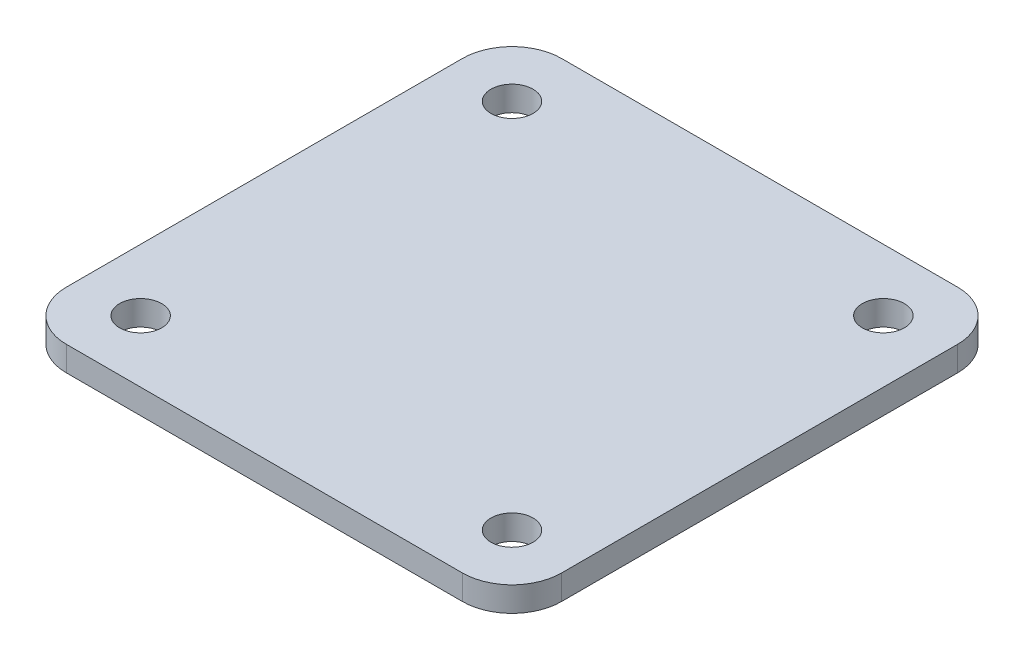
ISO-10303-21;
HEADER;
FILE_DESCRIPTION(('STEP AP214'),'2;1');
FILE_NAME('part.step','',(''),(''),'','','');
FILE_SCHEMA(('AUTOMOTIVE_DESIGN { 1 0 10303 214 1 1 1 1 }'));
ENDSEC;
DATA;
#1=APPLICATION_CONTEXT('core data for automotive mechanical design processes');
#2=APPLICATION_PROTOCOL_DEFINITION('international standard','automotive_design',2000,#1);
#3=PRODUCT_CONTEXT('',#1,'mechanical');
#4=PRODUCT('Part','Part','',(#3));
#5=PRODUCT_RELATED_PRODUCT_CATEGORY('part','',(#4));
#6=PRODUCT_DEFINITION_FORMATION('','',#4);
#7=PRODUCT_DEFINITION_CONTEXT('part definition',#1,'design');
#8=PRODUCT_DEFINITION('design','',#6,#7);
#9=PRODUCT_DEFINITION_SHAPE('','',#8);
#10=(LENGTH_UNIT() NAMED_UNIT(*) SI_UNIT(.MILLI.,.METRE.));
#11=(NAMED_UNIT(*) PLANE_ANGLE_UNIT() SI_UNIT($,.RADIAN.));
#12=(NAMED_UNIT(*) SI_UNIT($,.STERADIAN.) SOLID_ANGLE_UNIT());
#13=UNCERTAINTY_MEASURE_WITH_UNIT(LENGTH_MEASURE(1.E-05),#10,'distance_accuracy_value','');
#14=(GEOMETRIC_REPRESENTATION_CONTEXT(3) GLOBAL_UNCERTAINTY_ASSIGNED_CONTEXT((#13)) GLOBAL_UNIT_ASSIGNED_CONTEXT((#10,
#11,#12)) REPRESENTATION_CONTEXT('',''));
#15=CARTESIAN_POINT('',(0.,0.,0.));
#16=DIRECTION('',(0.,0.,1.));
#17=DIRECTION('',(1.,0.,0.));
#18=AXIS2_PLACEMENT_3D('',#15,#16,#17);
#19=CARTESIAN_POINT('',(-20.,2.,-20.));
#20=DIRECTION('',(1.,0.,0.));
#21=DIRECTION('',(0.,0.,-1.));
#22=AXIS2_PLACEMENT_3D('',#19,#20,#21);
#23=PLANE('',#22);
#24=DIRECTION('',(0.,0.,1.));
#25=VECTOR('',#24,1.);
#26=CARTESIAN_POINT('',(-20.,2.,-20.));
#27=LINE('',#26,#25);
#28=CARTESIAN_POINT('',(-20.,2.,-16.));
#29=VERTEX_POINT('',#28);
#30=CARTESIAN_POINT('',(-20.,2.,16.));
#31=VERTEX_POINT('',#30);
#32=EDGE_CURVE('E118',#29,#31,#27,.T.);
#33=ORIENTED_EDGE('',*,*,#32,.F.);
#34=DIRECTION('',(0.,-1.,0.));
#35=VECTOR('',#34,1.);
#36=CARTESIAN_POINT('',(-20.,2.,-16.));
#37=LINE('',#36,#35);
#38=CARTESIAN_POINT('',(-20.,0.,-16.));
#39=VERTEX_POINT('',#38);
#40=EDGE_CURVE('E103',#29,#39,#37,.T.);
#41=ORIENTED_EDGE('',*,*,#40,.T.);
#42=DIRECTION('',(0.,0.,1.));
#43=VECTOR('',#42,1.);
#44=CARTESIAN_POINT('',(-20.,0.,-20.));
#45=LINE('',#44,#43);
#46=CARTESIAN_POINT('',(-20.,0.,16.));
#47=VERTEX_POINT('',#46);
#48=EDGE_CURVE('E115',#39,#47,#45,.T.);
#49=ORIENTED_EDGE('',*,*,#48,.T.);
#50=DIRECTION('',(0.,-1.,0.));
#51=VECTOR('',#50,1.);
#52=CARTESIAN_POINT('',(-20.,2.,16.));
#53=LINE('',#52,#51);
#54=EDGE_CURVE('E120',#47,#31,#53,.F.);
#55=ORIENTED_EDGE('',*,*,#54,.T.);
#56=EDGE_LOOP('',(#33,#41,#49,#55));
#57=FACE_BOUND('',#56,.T.);
#58=ADVANCED_FACE('F33',(#57),#23,.F.);
#59=CARTESIAN_POINT('',(20.,2.,20.));
#60=DIRECTION('',(0.,0.,-1.));
#61=DIRECTION('',(-1.,0.,0.));
#62=AXIS2_PLACEMENT_3D('',#59,#60,#61);
#63=PLANE('',#62);
#64=DIRECTION('',(1.,0.,0.));
#65=VECTOR('',#64,1.);
#66=CARTESIAN_POINT('',(20.,2.,20.));
#67=LINE('',#66,#65);
#68=CARTESIAN_POINT('',(-16.,2.,20.));
#69=VERTEX_POINT('',#68);
#70=CARTESIAN_POINT('',(16.,2.,20.));
#71=VERTEX_POINT('',#70);
#72=EDGE_CURVE('E164',#69,#71,#67,.T.);
#73=ORIENTED_EDGE('',*,*,#72,.F.);
#74=DIRECTION('',(0.,-1.,0.));
#75=VECTOR('',#74,1.);
#76=CARTESIAN_POINT('',(-16.,2.,20.));
#77=LINE('',#76,#75);
#78=CARTESIAN_POINT('',(-16.,0.,20.));
#79=VERTEX_POINT('',#78);
#80=EDGE_CURVE('E157',#69,#79,#77,.T.);
#81=ORIENTED_EDGE('',*,*,#80,.T.);
#82=DIRECTION('',(1.,0.,0.));
#83=VECTOR('',#82,1.);
#84=CARTESIAN_POINT('',(20.,0.,20.));
#85=LINE('',#84,#83);
#86=CARTESIAN_POINT('',(16.,0.,20.));
#87=VERTEX_POINT('',#86);
#88=EDGE_CURVE('E124',#79,#87,#85,.T.);
#89=ORIENTED_EDGE('',*,*,#88,.T.);
#90=DIRECTION('',(0.,-1.,0.));
#91=VECTOR('',#90,1.);
#92=CARTESIAN_POINT('',(16.,2.,20.));
#93=LINE('',#92,#91);
#94=EDGE_CURVE('E155',#87,#71,#93,.F.);
#95=ORIENTED_EDGE('',*,*,#94,.T.);
#96=EDGE_LOOP('',(#73,#81,#89,#95));
#97=FACE_BOUND('',#96,.T.);
#98=ADVANCED_FACE('F162',(#97),#63,.F.);
#99=CARTESIAN_POINT('',(20.,2.,-20.));
#100=DIRECTION('',(-1.,0.,0.));
#101=DIRECTION('',(0.,0.,1.));
#102=AXIS2_PLACEMENT_3D('',#99,#100,#101);
#103=PLANE('',#102);
#104=DIRECTION('',(0.,0.,-1.));
#105=VECTOR('',#104,1.);
#106=CARTESIAN_POINT('',(20.,2.,-20.));
#107=LINE('',#106,#105);
#108=CARTESIAN_POINT('',(20.,2.,16.));
#109=VERTEX_POINT('',#108);
#110=CARTESIAN_POINT('',(20.,2.,-16.));
#111=VERTEX_POINT('',#110);
#112=EDGE_CURVE('E172',#109,#111,#107,.T.);
#113=ORIENTED_EDGE('',*,*,#112,.F.);
#114=DIRECTION('',(0.,-1.,0.));
#115=VECTOR('',#114,1.);
#116=CARTESIAN_POINT('',(20.,2.,16.));
#117=LINE('',#116,#115);
#118=CARTESIAN_POINT('',(20.,0.,16.));
#119=VERTEX_POINT('',#118);
#120=EDGE_CURVE('E11',#109,#119,#117,.T.);
#121=ORIENTED_EDGE('',*,*,#120,.T.);
#122=DIRECTION('',(0.,0.,-1.));
#123=VECTOR('',#122,1.);
#124=CARTESIAN_POINT('',(20.,0.,-20.));
#125=LINE('',#124,#123);
#126=CARTESIAN_POINT('',(20.,0.,-16.));
#127=VERTEX_POINT('',#126);
#128=EDGE_CURVE('E128',#119,#127,#125,.T.);
#129=ORIENTED_EDGE('',*,*,#128,.T.);
#130=DIRECTION('',(0.,-1.,0.));
#131=VECTOR('',#130,1.);
#132=CARTESIAN_POINT('',(20.,2.,-16.));
#133=LINE('',#132,#131);
#134=EDGE_CURVE('E41',#127,#111,#133,.F.);
#135=ORIENTED_EDGE('',*,*,#134,.T.);
#136=EDGE_LOOP('',(#113,#121,#129,#135));
#137=FACE_BOUND('',#136,.T.);
#138=ADVANCED_FACE('F171',(#137),#103,.F.);
#139=CARTESIAN_POINT('',(20.,2.,-20.));
#140=DIRECTION('',(0.,0.,1.));
#141=DIRECTION('',(1.,0.,0.));
#142=AXIS2_PLACEMENT_3D('',#139,#140,#141);
#143=PLANE('',#142);
#144=DIRECTION('',(-1.,0.,0.));
#145=VECTOR('',#144,1.);
#146=CARTESIAN_POINT('',(20.,0.,-20.));
#147=LINE('',#146,#145);
#148=CARTESIAN_POINT('',(16.,0.,-20.));
#149=VERTEX_POINT('',#148);
#150=CARTESIAN_POINT('',(-16.,0.,-20.));
#151=VERTEX_POINT('',#150);
#152=EDGE_CURVE('E138',#149,#151,#147,.T.);
#153=ORIENTED_EDGE('',*,*,#152,.T.);
#154=DIRECTION('',(0.,-1.,0.));
#155=VECTOR('',#154,1.);
#156=CARTESIAN_POINT('',(-16.,2.,-20.));
#157=LINE('',#156,#155);
#158=CARTESIAN_POINT('',(-16.,2.,-20.));
#159=VERTEX_POINT('',#158);
#160=EDGE_CURVE('E104',#151,#159,#157,.F.);
#161=ORIENTED_EDGE('',*,*,#160,.T.);
#162=DIRECTION('',(-1.,0.,0.));
#163=VECTOR('',#162,1.);
#164=CARTESIAN_POINT('',(20.,2.,-20.));
#165=LINE('',#164,#163);
#166=CARTESIAN_POINT('',(16.,2.,-20.));
#167=VERTEX_POINT('',#166);
#168=EDGE_CURVE('E134',#167,#159,#165,.T.);
#169=ORIENTED_EDGE('',*,*,#168,.F.);
#170=DIRECTION('',(0.,-1.,0.));
#171=VECTOR('',#170,1.);
#172=CARTESIAN_POINT('',(16.,2.,-20.));
#173=LINE('',#172,#171);
#174=EDGE_CURVE('E109',#167,#149,#173,.T.);
#175=ORIENTED_EDGE('',*,*,#174,.T.);
#176=EDGE_LOOP('',(#153,#161,#169,#175));
#177=FACE_BOUND('',#176,.T.);
#178=ADVANCED_FACE('F212',(#177),#143,.F.);
#179=CARTESIAN_POINT('',(0.,2.,0.));
#180=DIRECTION('',(0.,-1.,0.));
#181=DIRECTION('',(0.,0.,-1.));
#182=AXIS2_PLACEMENT_3D('',#179,#180,#181);
#183=PLANE('',#182);
#184=CARTESIAN_POINT('',(-15.,2.,-15.));
#185=DIRECTION('',(0.,1.,0.));
#186=DIRECTION('',(0.,0.,1.));
#187=AXIS2_PLACEMENT_3D('',#184,#185,#186);
#188=CIRCLE('',#187,1.7);
#189=CARTESIAN_POINT('',(-15.,2.,-13.3));
#190=VERTEX_POINT('',#189);
#191=EDGE_CURVE('E181',#190,#190,#188,.T.);
#192=ORIENTED_EDGE('',*,*,#191,.F.);
#193=EDGE_LOOP('',(#192));
#194=FACE_BOUND('',#193,.T.);
#195=CARTESIAN_POINT('',(-15.,2.,15.));
#196=DIRECTION('',(0.,1.,0.));
#197=DIRECTION('',(0.,0.,1.));
#198=AXIS2_PLACEMENT_3D('',#195,#196,#197);
#199=CIRCLE('',#198,1.7);
#200=CARTESIAN_POINT('',(-15.,2.,16.7));
#201=VERTEX_POINT('',#200);
#202=EDGE_CURVE('E187',#201,#201,#199,.T.);
#203=ORIENTED_EDGE('',*,*,#202,.F.);
#204=EDGE_LOOP('',(#203));
#205=FACE_BOUND('',#204,.T.);
#206=CARTESIAN_POINT('',(15.,2.,15.));
#207=DIRECTION('',(0.,1.,0.));
#208=DIRECTION('',(0.,0.,1.));
#209=AXIS2_PLACEMENT_3D('',#206,#207,#208);
#210=CIRCLE('',#209,1.7);
#211=CARTESIAN_POINT('',(15.,2.,16.7));
#212=VERTEX_POINT('',#211);
#213=EDGE_CURVE('E193',#212,#212,#210,.T.);
#214=ORIENTED_EDGE('',*,*,#213,.F.);
#215=EDGE_LOOP('',(#214));
#216=FACE_BOUND('',#215,.T.);
#217=CARTESIAN_POINT('',(15.,2.,-15.));
#218=DIRECTION('',(0.,1.,0.));
#219=DIRECTION('',(0.,0.,1.));
#220=AXIS2_PLACEMENT_3D('',#217,#218,#219);
#221=CIRCLE('',#220,1.7);
#222=CARTESIAN_POINT('',(15.,2.,-13.3));
#223=VERTEX_POINT('',#222);
#224=EDGE_CURVE('E131',#223,#223,#221,.T.);
#225=ORIENTED_EDGE('',*,*,#224,.F.);
#226=EDGE_LOOP('',(#225));
#227=FACE_BOUND('',#226,.T.);
#228=ORIENTED_EDGE('',*,*,#168,.T.);
#229=CARTESIAN_POINT('',(-16.,2.,-16.));
#230=DIRECTION('',(0.,-1.,0.));
#231=DIRECTION('',(0.,0.,-1.));
#232=AXIS2_PLACEMENT_3D('',#229,#230,#231);
#233=CIRCLE('',#232,4.);
#234=EDGE_CURVE('E153',#159,#29,#233,.F.);
#235=ORIENTED_EDGE('',*,*,#234,.T.);
#236=ORIENTED_EDGE('',*,*,#32,.T.);
#237=CARTESIAN_POINT('',(-16.,2.,16.));
#238=DIRECTION('',(0.,-1.,0.));
#239=DIRECTION('',(0.,0.,-1.));
#240=AXIS2_PLACEMENT_3D('',#237,#238,#239);
#241=CIRCLE('',#240,4.);
#242=EDGE_CURVE('E151',#31,#69,#241,.F.);
#243=ORIENTED_EDGE('',*,*,#242,.T.);
#244=ORIENTED_EDGE('',*,*,#72,.T.);
#245=CARTESIAN_POINT('',(16.,2.,16.));
#246=DIRECTION('',(0.,-1.,0.));
#247=DIRECTION('',(0.,0.,-1.));
#248=AXIS2_PLACEMENT_3D('',#245,#246,#247);
#249=CIRCLE('',#248,4.);
#250=EDGE_CURVE('E54',#71,#109,#249,.F.);
#251=ORIENTED_EDGE('',*,*,#250,.T.);
#252=ORIENTED_EDGE('',*,*,#112,.T.);
#253=CARTESIAN_POINT('',(16.,2.,-16.));
#254=DIRECTION('',(0.,-1.,0.));
#255=DIRECTION('',(0.,0.,-1.));
#256=AXIS2_PLACEMENT_3D('',#253,#254,#255);
#257=CIRCLE('',#256,4.);
#258=EDGE_CURVE('E148',#111,#167,#257,.F.);
#259=ORIENTED_EDGE('',*,*,#258,.T.);
#260=EDGE_LOOP('',(#228,#235,#236,#243,#244,#251,#252,#259));
#261=FACE_BOUND('',#260,.T.);
#262=ADVANCED_FACE('F209',(#194,#205,#216,#227,#261),#183,.F.);
#263=CARTESIAN_POINT('',(0.,0.,0.));
#264=DIRECTION('',(0.,-1.,0.));
#265=DIRECTION('',(0.,0.,-1.));
#266=AXIS2_PLACEMENT_3D('',#263,#264,#265);
#267=PLANE('',#266);
#268=CARTESIAN_POINT('',(-15.,0.,-15.));
#269=DIRECTION('',(0.,1.,0.));
#270=DIRECTION('',(0.,0.,1.));
#271=AXIS2_PLACEMENT_3D('',#268,#269,#270);
#272=CIRCLE('',#271,1.7);
#273=CARTESIAN_POINT('',(-15.,0.,-13.3));
#274=VERTEX_POINT('',#273);
#275=EDGE_CURVE('E184',#274,#274,#272,.T.);
#276=ORIENTED_EDGE('',*,*,#275,.T.);
#277=EDGE_LOOP('',(#276));
#278=FACE_BOUND('',#277,.T.);
#279=CARTESIAN_POINT('',(-15.,0.,15.));
#280=DIRECTION('',(0.,1.,0.));
#281=DIRECTION('',(0.,0.,1.));
#282=AXIS2_PLACEMENT_3D('',#279,#280,#281);
#283=CIRCLE('',#282,1.7);
#284=CARTESIAN_POINT('',(-15.,0.,16.7));
#285=VERTEX_POINT('',#284);
#286=EDGE_CURVE('E190',#285,#285,#283,.T.);
#287=ORIENTED_EDGE('',*,*,#286,.T.);
#288=EDGE_LOOP('',(#287));
#289=FACE_BOUND('',#288,.T.);
#290=CARTESIAN_POINT('',(15.,0.,15.));
#291=DIRECTION('',(0.,1.,0.));
#292=DIRECTION('',(0.,0.,1.));
#293=AXIS2_PLACEMENT_3D('',#290,#291,#292);
#294=CIRCLE('',#293,1.7);
#295=CARTESIAN_POINT('',(15.,0.,16.7));
#296=VERTEX_POINT('',#295);
#297=EDGE_CURVE('E179',#296,#296,#294,.T.);
#298=ORIENTED_EDGE('',*,*,#297,.T.);
#299=EDGE_LOOP('',(#298));
#300=FACE_BOUND('',#299,.T.);
#301=CARTESIAN_POINT('',(15.,0.,-15.));
#302=DIRECTION('',(0.,1.,0.));
#303=DIRECTION('',(0.,0.,1.));
#304=AXIS2_PLACEMENT_3D('',#301,#302,#303);
#305=CIRCLE('',#304,1.7);
#306=CARTESIAN_POINT('',(15.,0.,-13.3));
#307=VERTEX_POINT('',#306);
#308=EDGE_CURVE('E125',#307,#307,#305,.T.);
#309=ORIENTED_EDGE('',*,*,#308,.T.);
#310=EDGE_LOOP('',(#309));
#311=FACE_BOUND('',#310,.T.);
#312=ORIENTED_EDGE('',*,*,#48,.F.);
#313=CARTESIAN_POINT('',(-16.,0.,-16.));
#314=DIRECTION('',(0.,-1.,0.));
#315=DIRECTION('',(0.,0.,-1.));
#316=AXIS2_PLACEMENT_3D('',#313,#314,#315);
#317=CIRCLE('',#316,4.);
#318=EDGE_CURVE('E99',#39,#151,#317,.T.);
#319=ORIENTED_EDGE('',*,*,#318,.T.);
#320=ORIENTED_EDGE('',*,*,#152,.F.);
#321=CARTESIAN_POINT('',(16.,0.,-16.));
#322=DIRECTION('',(0.,-1.,0.));
#323=DIRECTION('',(0.,0.,-1.));
#324=AXIS2_PLACEMENT_3D('',#321,#322,#323);
#325=CIRCLE('',#324,4.);
#326=EDGE_CURVE('E119',#149,#127,#325,.T.);
#327=ORIENTED_EDGE('',*,*,#326,.T.);
#328=ORIENTED_EDGE('',*,*,#128,.F.);
#329=CARTESIAN_POINT('',(16.,0.,16.));
#330=DIRECTION('',(0.,-1.,0.));
#331=DIRECTION('',(0.,0.,-1.));
#332=AXIS2_PLACEMENT_3D('',#329,#330,#331);
#333=CIRCLE('',#332,4.);
#334=EDGE_CURVE('E142',#119,#87,#333,.T.);
#335=ORIENTED_EDGE('',*,*,#334,.T.);
#336=ORIENTED_EDGE('',*,*,#88,.F.);
#337=CARTESIAN_POINT('',(-16.,0.,16.));
#338=DIRECTION('',(0.,-1.,0.));
#339=DIRECTION('',(0.,0.,-1.));
#340=AXIS2_PLACEMENT_3D('',#337,#338,#339);
#341=CIRCLE('',#340,4.);
#342=EDGE_CURVE('E110',#79,#47,#341,.T.);
#343=ORIENTED_EDGE('',*,*,#342,.T.);
#344=EDGE_LOOP('',(#312,#319,#320,#327,#328,#335,#336,#343));
#345=FACE_BOUND('',#344,.T.);
#346=ADVANCED_FACE('F122',(#278,#289,#300,#311,#345),#267,.T.);
#347=CARTESIAN_POINT('',(15.,0.,-15.));
#348=DIRECTION('',(0.,1.,0.));
#349=DIRECTION('',(0.,0.,1.));
#350=AXIS2_PLACEMENT_3D('',#347,#348,#349);
#351=CYLINDRICAL_SURFACE('',#350,1.7);
#352=ORIENTED_EDGE('',*,*,#308,.F.);
#353=EDGE_LOOP('',(#352));
#354=FACE_BOUND('',#353,.T.);
#355=ORIENTED_EDGE('',*,*,#224,.T.);
#356=EDGE_LOOP('',(#355));
#357=FACE_BOUND('',#356,.T.);
#358=ADVANCED_FACE('F205',(#354,#357),#351,.F.);
#359=CARTESIAN_POINT('',(15.,0.,15.));
#360=DIRECTION('',(0.,1.,0.));
#361=DIRECTION('',(0.,0.,1.));
#362=AXIS2_PLACEMENT_3D('',#359,#360,#361);
#363=CYLINDRICAL_SURFACE('',#362,1.7);
#364=ORIENTED_EDGE('',*,*,#297,.F.);
#365=EDGE_LOOP('',(#364));
#366=FACE_BOUND('',#365,.T.);
#367=ORIENTED_EDGE('',*,*,#213,.T.);
#368=EDGE_LOOP('',(#367));
#369=FACE_BOUND('',#368,.T.);
#370=ADVANCED_FACE('F201',(#366,#369),#363,.F.);
#371=CARTESIAN_POINT('',(-15.,0.,15.));
#372=DIRECTION('',(0.,1.,0.));
#373=DIRECTION('',(0.,0.,1.));
#374=AXIS2_PLACEMENT_3D('',#371,#372,#373);
#375=CYLINDRICAL_SURFACE('',#374,1.7);
#376=ORIENTED_EDGE('',*,*,#286,.F.);
#377=EDGE_LOOP('',(#376));
#378=FACE_BOUND('',#377,.T.);
#379=ORIENTED_EDGE('',*,*,#202,.T.);
#380=EDGE_LOOP('',(#379));
#381=FACE_BOUND('',#380,.T.);
#382=ADVANCED_FACE('F204',(#378,#381),#375,.F.);
#383=CARTESIAN_POINT('',(-15.,0.,-15.));
#384=DIRECTION('',(0.,1.,0.));
#385=DIRECTION('',(0.,0.,1.));
#386=AXIS2_PLACEMENT_3D('',#383,#384,#385);
#387=CYLINDRICAL_SURFACE('',#386,1.7);
#388=ORIENTED_EDGE('',*,*,#275,.F.);
#389=EDGE_LOOP('',(#388));
#390=FACE_BOUND('',#389,.T.);
#391=ORIENTED_EDGE('',*,*,#191,.T.);
#392=EDGE_LOOP('',(#391));
#393=FACE_BOUND('',#392,.T.);
#394=ADVANCED_FACE('F235',(#390,#393),#387,.F.);
#395=CARTESIAN_POINT('',(-16.,2.,-16.));
#396=DIRECTION('',(0.,-1.,0.));
#397=DIRECTION('',(0.,0.,-1.));
#398=AXIS2_PLACEMENT_3D('',#395,#396,#397);
#399=CYLINDRICAL_SURFACE('',#398,4.);
#400=ORIENTED_EDGE('',*,*,#234,.F.);
#401=ORIENTED_EDGE('',*,*,#160,.F.);
#402=ORIENTED_EDGE('',*,*,#318,.F.);
#403=ORIENTED_EDGE('',*,*,#40,.F.);
#404=EDGE_LOOP('',(#400,#401,#402,#403));
#405=FACE_BOUND('',#404,.T.);
#406=ADVANCED_FACE('F102',(#405),#399,.T.);
#407=CARTESIAN_POINT('',(-16.,2.,16.));
#408=DIRECTION('',(0.,-1.,0.));
#409=DIRECTION('',(0.,0.,-1.));
#410=AXIS2_PLACEMENT_3D('',#407,#408,#409);
#411=CYLINDRICAL_SURFACE('',#410,4.);
#412=ORIENTED_EDGE('',*,*,#242,.F.);
#413=ORIENTED_EDGE('',*,*,#54,.F.);
#414=ORIENTED_EDGE('',*,*,#342,.F.);
#415=ORIENTED_EDGE('',*,*,#80,.F.);
#416=EDGE_LOOP('',(#412,#413,#414,#415));
#417=FACE_BOUND('',#416,.T.);
#418=ADVANCED_FACE('F224',(#417),#411,.T.);
#419=CARTESIAN_POINT('',(16.,2.,16.));
#420=DIRECTION('',(0.,-1.,0.));
#421=DIRECTION('',(0.,0.,-1.));
#422=AXIS2_PLACEMENT_3D('',#419,#420,#421);
#423=CYLINDRICAL_SURFACE('',#422,4.);
#424=ORIENTED_EDGE('',*,*,#250,.F.);
#425=ORIENTED_EDGE('',*,*,#94,.F.);
#426=ORIENTED_EDGE('',*,*,#334,.F.);
#427=ORIENTED_EDGE('',*,*,#120,.F.);
#428=EDGE_LOOP('',(#424,#425,#426,#427));
#429=FACE_BOUND('',#428,.T.);
#430=ADVANCED_FACE('F170',(#429),#423,.T.);
#431=CARTESIAN_POINT('',(16.,2.,-16.));
#432=DIRECTION('',(0.,-1.,0.));
#433=DIRECTION('',(0.,0.,-1.));
#434=AXIS2_PLACEMENT_3D('',#431,#432,#433);
#435=CYLINDRICAL_SURFACE('',#434,4.);
#436=ORIENTED_EDGE('',*,*,#258,.F.);
#437=ORIENTED_EDGE('',*,*,#134,.F.);
#438=ORIENTED_EDGE('',*,*,#326,.F.);
#439=ORIENTED_EDGE('',*,*,#174,.F.);
#440=EDGE_LOOP('',(#436,#437,#438,#439));
#441=FACE_BOUND('',#440,.T.);
#442=ADVANCED_FACE('F35',(#441),#435,.T.);
#443=CLOSED_SHELL('',(#58,#98,#138,#178,#262,#346,#358,#370,#382,#394,#406,#418,#430,#442));
#444=MANIFOLD_SOLID_BREP('B2',#443);
#445=ADVANCED_BREP_SHAPE_REPRESENTATION('',(#18,#444),#14);
#446=SHAPE_DEFINITION_REPRESENTATION(#9,#445);
ENDSEC;
END-ISO-10303-21;
